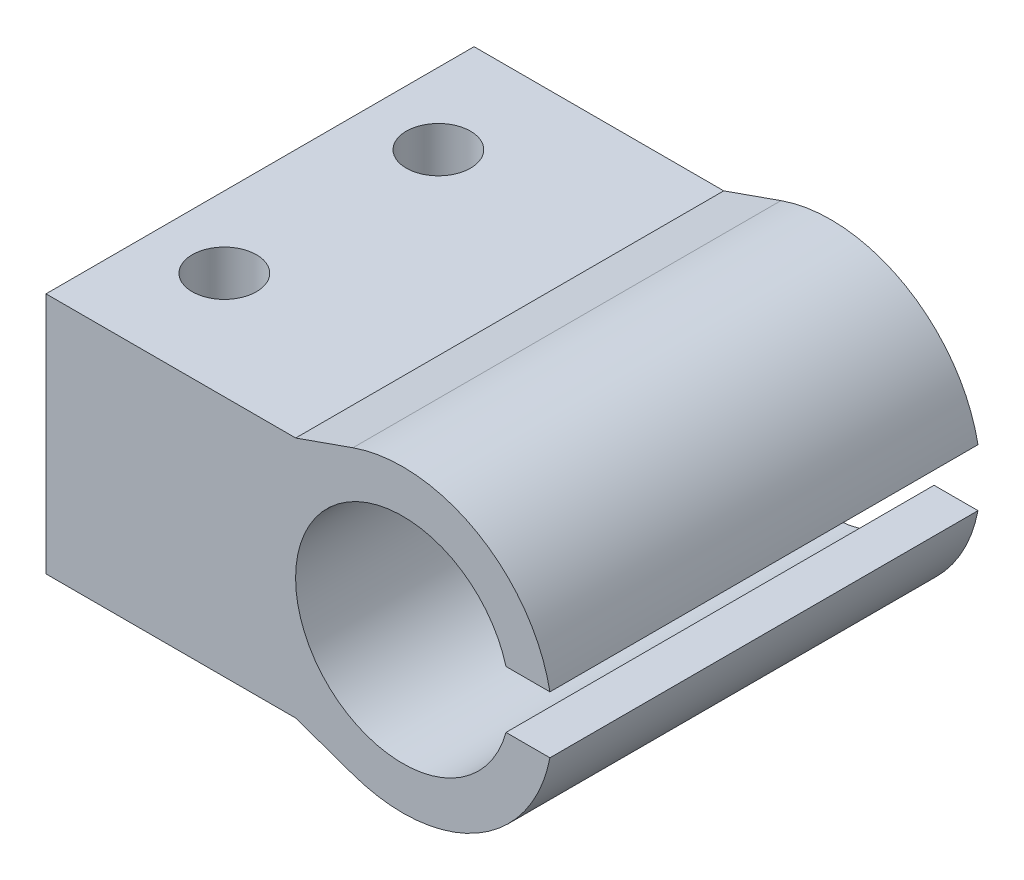
ISO-10303-21;
HEADER;
FILE_DESCRIPTION(('STEP AP214'),'2;1');
FILE_NAME('part.step','',(''),(''),'','','');
FILE_SCHEMA(('AUTOMOTIVE_DESIGN { 1 0 10303 214 1 1 1 1 }'));
ENDSEC;
DATA;
#1=APPLICATION_CONTEXT('core data for automotive mechanical design processes');
#2=APPLICATION_PROTOCOL_DEFINITION('international standard','automotive_design',2000,#1);
#3=PRODUCT_CONTEXT('',#1,'mechanical');
#4=PRODUCT('Part','Part','',(#3));
#5=PRODUCT_RELATED_PRODUCT_CATEGORY('part','',(#4));
#6=PRODUCT_DEFINITION_FORMATION('','',#4);
#7=PRODUCT_DEFINITION_CONTEXT('part definition',#1,'design');
#8=PRODUCT_DEFINITION('design','',#6,#7);
#9=PRODUCT_DEFINITION_SHAPE('','',#8);
#10=(LENGTH_UNIT() NAMED_UNIT(*) SI_UNIT(.MILLI.,.METRE.));
#11=(NAMED_UNIT(*) PLANE_ANGLE_UNIT() SI_UNIT($,.RADIAN.));
#12=(NAMED_UNIT(*) SI_UNIT($,.STERADIAN.) SOLID_ANGLE_UNIT());
#13=UNCERTAINTY_MEASURE_WITH_UNIT(LENGTH_MEASURE(1.E-05),#10,'distance_accuracy_value','');
#14=(GEOMETRIC_REPRESENTATION_CONTEXT(3) GLOBAL_UNCERTAINTY_ASSIGNED_CONTEXT((#13)) GLOBAL_UNIT_ASSIGNED_CONTEXT((#10,
#11,#12)) REPRESENTATION_CONTEXT('',''));
#15=CARTESIAN_POINT('',(0.,0.,0.));
#16=DIRECTION('',(0.,0.,1.));
#17=DIRECTION('',(1.,0.,0.));
#18=AXIS2_PLACEMENT_3D('',#15,#16,#17);
#19=CARTESIAN_POINT('',(-24.9999999999999,8.50000000000017,30.));
#20=DIRECTION('',(1.,0.,0.));
#21=DIRECTION('',(0.,0.,-1.));
#22=AXIS2_PLACEMENT_3D('',#19,#20,#21);
#23=PLANE('',#22);
#24=DIRECTION('',(0.,-1.,0.));
#25=VECTOR('',#24,1.);
#26=CARTESIAN_POINT('',(-24.9999999999999,8.50000000000017,0.));
#27=LINE('',#26,#25);
#28=CARTESIAN_POINT('',(-24.9999999999999,8.50000000000017,0.));
#29=VERTEX_POINT('',#28);
#30=CARTESIAN_POINT('',(-24.9999999999999,-8.49999999999973,0.));
#31=VERTEX_POINT('',#30);
#32=EDGE_CURVE('E144',#29,#31,#27,.T.);
#33=ORIENTED_EDGE('',*,*,#32,.T.);
#34=DIRECTION('',(0.,0.,-1.));
#35=VECTOR('',#34,1.);
#36=CARTESIAN_POINT('',(-24.9999999999999,-8.49999999999973,30.));
#37=LINE('',#36,#35);
#38=CARTESIAN_POINT('',(-24.9999999999999,-8.49999999999973,30.));
#39=VERTEX_POINT('',#38);
#40=EDGE_CURVE('E11',#39,#31,#37,.T.);
#41=ORIENTED_EDGE('',*,*,#40,.F.);
#42=DIRECTION('',(0.,-1.,0.));
#43=VECTOR('',#42,1.);
#44=CARTESIAN_POINT('',(-24.9999999999999,8.50000000000017,30.));
#45=LINE('',#44,#43);
#46=CARTESIAN_POINT('',(-24.9999999999999,8.50000000000017,30.));
#47=VERTEX_POINT('',#46);
#48=EDGE_CURVE('E163',#47,#39,#45,.T.);
#49=ORIENTED_EDGE('',*,*,#48,.F.);
#50=DIRECTION('',(0.,0.,-1.));
#51=VECTOR('',#50,1.);
#52=CARTESIAN_POINT('',(-24.9999999999999,8.50000000000017,30.));
#53=LINE('',#52,#51);
#54=EDGE_CURVE('E140',#47,#29,#53,.T.);
#55=ORIENTED_EDGE('',*,*,#54,.T.);
#56=EDGE_LOOP('',(#33,#41,#49,#55));
#57=FACE_BOUND('',#56,.T.);
#58=ADVANCED_FACE('F34',(#57),#23,.F.);
#59=CARTESIAN_POINT('',(-24.9999999999999,-8.49999999999973,30.));
#60=DIRECTION('',(0.,1.,0.));
#61=DIRECTION('',(0.,0.,1.));
#62=AXIS2_PLACEMENT_3D('',#59,#60,#61);
#63=PLANE('',#62);
#64=CARTESIAN_POINT('',(-19.9999999999999,-8.49999999999973,22.5));
#65=DIRECTION('',(0.,-1.,0.));
#66=DIRECTION('',(0.,0.,-1.));
#67=AXIS2_PLACEMENT_3D('',#64,#65,#66);
#68=CIRCLE('',#67,2.25);
#69=CARTESIAN_POINT('',(-19.9999999999999,-8.49999999999973,20.25));
#70=VERTEX_POINT('',#69);
#71=EDGE_CURVE('E189',#70,#70,#68,.T.);
#72=ORIENTED_EDGE('',*,*,#71,.F.);
#73=EDGE_LOOP('',(#72));
#74=FACE_BOUND('',#73,.T.);
#75=CARTESIAN_POINT('',(-19.9999999999999,-8.49999999999973,7.5));
#76=DIRECTION('',(0.,-1.,0.));
#77=DIRECTION('',(0.,0.,-1.));
#78=AXIS2_PLACEMENT_3D('',#75,#76,#77);
#79=CIRCLE('',#78,2.25);
#80=CARTESIAN_POINT('',(-19.9999999999999,-8.49999999999973,5.25));
#81=VERTEX_POINT('',#80);
#82=EDGE_CURVE('E181',#81,#81,#79,.T.);
#83=ORIENTED_EDGE('',*,*,#82,.F.);
#84=EDGE_LOOP('',(#83));
#85=FACE_BOUND('',#84,.T.);
#86=DIRECTION('',(1.,0.,0.));
#87=VECTOR('',#86,1.);
#88=CARTESIAN_POINT('',(-24.9999999999999,-8.49999999999973,0.));
#89=LINE('',#88,#87);
#90=CARTESIAN_POINT('',(-7.49999999999984,-8.49999999999973,0.));
#91=VERTEX_POINT('',#90);
#92=EDGE_CURVE('E147',#31,#91,#89,.T.);
#93=ORIENTED_EDGE('',*,*,#92,.T.);
#94=DIRECTION('',(0.,0.,-1.));
#95=VECTOR('',#94,1.);
#96=CARTESIAN_POINT('',(-7.49999999999984,-8.49999999999973,30.));
#97=LINE('',#96,#95);
#98=CARTESIAN_POINT('',(-7.49999999999984,-8.49999999999973,30.));
#99=VERTEX_POINT('',#98);
#100=EDGE_CURVE('E43',#99,#91,#97,.T.);
#101=ORIENTED_EDGE('',*,*,#100,.F.);
#102=DIRECTION('',(1.,0.,0.));
#103=VECTOR('',#102,1.);
#104=CARTESIAN_POINT('',(-24.9999999999999,-8.49999999999973,30.));
#105=LINE('',#104,#103);
#106=EDGE_CURVE('E101',#39,#99,#105,.T.);
#107=ORIENTED_EDGE('',*,*,#106,.F.);
#108=ORIENTED_EDGE('',*,*,#40,.T.);
#109=EDGE_LOOP('',(#93,#101,#107,#108));
#110=FACE_BOUND('',#109,.T.);
#111=ADVANCED_FACE('F230',(#74,#85,#110),#63,.F.);
#112=CARTESIAN_POINT('',(-7.49999999999984,-8.49999999999973,30.));
#113=DIRECTION('',(0.332114966471355,0.943238914085785,0.));
#114=DIRECTION('',(-0.943238914085785,0.332114966471355,0.));
#115=AXIS2_PLACEMENT_3D('',#112,#113,#114);
#116=PLANE('',#115);
#117=DIRECTION('',(0.943238914085785,-0.332114966471355,0.));
#118=VECTOR('',#117,1.);
#119=CARTESIAN_POINT('',(-7.49999999999984,-8.49999999999973,0.));
#120=LINE('',#119,#118);
#121=CARTESIAN_POINT('',(-3.48999459492783,-9.91192521933427,0.));
#122=VERTEX_POINT('',#121);
#123=EDGE_CURVE('E150',#91,#122,#120,.T.);
#124=ORIENTED_EDGE('',*,*,#123,.T.);
#125=DIRECTION('',(0.,0.,-1.));
#126=VECTOR('',#125,1.);
#127=CARTESIAN_POINT('',(-3.48999459492783,-9.91192521933427,30.));
#128=LINE('',#127,#126);
#129=CARTESIAN_POINT('',(-3.48999459492783,-9.91192521933427,30.));
#130=VERTEX_POINT('',#129);
#131=EDGE_CURVE('E176',#130,#122,#128,.T.);
#132=ORIENTED_EDGE('',*,*,#131,.F.);
#133=DIRECTION('',(0.943238914085785,-0.332114966471355,0.));
#134=VECTOR('',#133,1.);
#135=CARTESIAN_POINT('',(-7.49999999999984,-8.49999999999973,30.));
#136=LINE('',#135,#134);
#137=EDGE_CURVE('E194',#99,#130,#136,.T.);
#138=ORIENTED_EDGE('',*,*,#137,.F.);
#139=ORIENTED_EDGE('',*,*,#100,.T.);
#140=EDGE_LOOP('',(#124,#132,#138,#139));
#141=FACE_BOUND('',#140,.T.);
#142=ADVANCED_FACE('F234',(#141),#116,.F.);
#143=CARTESIAN_POINT('',(0.,0.,30.));
#144=DIRECTION('',(0.,0.,-1.));
#145=DIRECTION('',(-1.,0.,0.));
#146=AXIS2_PLACEMENT_3D('',#143,#144,#145);
#147=CYLINDRICAL_SURFACE('',#146,10.508393018264);
#148=CARTESIAN_POINT('',(0.,0.,0.));
#149=DIRECTION('',(0.,0.,1.));
#150=DIRECTION('',(1.,0.,0.));
#151=AXIS2_PLACEMENT_3D('',#148,#149,#150);
#152=CIRCLE('',#151,10.508393018264);
#153=CARTESIAN_POINT('',(10.3163134804203,-1.99999999999978,0.));
#154=VERTEX_POINT('',#153);
#155=EDGE_CURVE('E152',#122,#154,#152,.T.);
#156=ORIENTED_EDGE('',*,*,#155,.T.);
#157=DIRECTION('',(0.,0.,-1.));
#158=VECTOR('',#157,1.);
#159=CARTESIAN_POINT('',(10.3163134804203,-1.99999999999978,30.));
#160=LINE('',#159,#158);
#161=CARTESIAN_POINT('',(10.3163134804203,-1.99999999999978,30.));
#162=VERTEX_POINT('',#161);
#163=EDGE_CURVE('E173',#162,#154,#160,.T.);
#164=ORIENTED_EDGE('',*,*,#163,.F.);
#165=CARTESIAN_POINT('',(0.,0.,30.));
#166=DIRECTION('',(0.,0.,1.));
#167=DIRECTION('',(1.,0.,0.));
#168=AXIS2_PLACEMENT_3D('',#165,#166,#167);
#169=CIRCLE('',#168,10.508393018264);
#170=EDGE_CURVE('E196',#130,#162,#169,.T.);
#171=ORIENTED_EDGE('',*,*,#170,.F.);
#172=ORIENTED_EDGE('',*,*,#131,.T.);
#173=EDGE_LOOP('',(#156,#164,#171,#172));
#174=FACE_BOUND('',#173,.T.);
#175=ADVANCED_FACE('F239',(#174),#147,.T.);
#176=CARTESIAN_POINT('',(7.23712413301853,-1.99999999999979,30.));
#177=DIRECTION('',(0.,-1.,0.));
#178=DIRECTION('',(1.,0.,0.));
#179=AXIS2_PLACEMENT_3D('',#176,#177,#178);
#180=PLANE('',#179);
#181=DIRECTION('',(-1.,0.,0.));
#182=VECTOR('',#181,1.);
#183=CARTESIAN_POINT('',(7.23712413301853,-1.99999999999979,0.));
#184=LINE('',#183,#182);
#185=CARTESIAN_POINT('',(7.23712413301853,-1.99999999999979,0.));
#186=VERTEX_POINT('',#185);
#187=EDGE_CURVE('E154',#154,#186,#184,.T.);
#188=ORIENTED_EDGE('',*,*,#187,.T.);
#189=DIRECTION('',(0.,0.,-1.));
#190=VECTOR('',#189,1.);
#191=CARTESIAN_POINT('',(7.23712413301853,-1.99999999999979,30.));
#192=LINE('',#191,#190);
#193=CARTESIAN_POINT('',(7.23712413301853,-1.99999999999979,30.));
#194=VERTEX_POINT('',#193);
#195=EDGE_CURVE('E170',#194,#186,#192,.T.);
#196=ORIENTED_EDGE('',*,*,#195,.F.);
#197=DIRECTION('',(-1.,0.,0.));
#198=VECTOR('',#197,1.);
#199=CARTESIAN_POINT('',(7.23712413301853,-1.99999999999979,30.));
#200=LINE('',#199,#198);
#201=EDGE_CURVE('E198',#162,#194,#200,.T.);
#202=ORIENTED_EDGE('',*,*,#201,.F.);
#203=ORIENTED_EDGE('',*,*,#163,.T.);
#204=EDGE_LOOP('',(#188,#196,#202,#203));
#205=FACE_BOUND('',#204,.T.);
#206=ADVANCED_FACE('F247',(#205),#180,.F.);
#207=CARTESIAN_POINT('',(0.,0.,30.));
#208=DIRECTION('',(0.,0.,-1.));
#209=DIRECTION('',(-1.,0.,0.));
#210=AXIS2_PLACEMENT_3D('',#207,#208,#209);
#211=CYLINDRICAL_SURFACE('',#210,7.50839301826418);
#212=CARTESIAN_POINT('',(0.,0.,0.));
#213=DIRECTION('',(0.,0.,-1.));
#214=DIRECTION('',(1.,0.,0.));
#215=AXIS2_PLACEMENT_3D('',#212,#213,#214);
#216=CIRCLE('',#215,7.50839301826418);
#217=CARTESIAN_POINT('',(7.23712413301841,2.00000000000021,0.));
#218=VERTEX_POINT('',#217);
#219=EDGE_CURVE('E156',#186,#218,#216,.T.);
#220=ORIENTED_EDGE('',*,*,#219,.T.);
#221=DIRECTION('',(0.,0.,-1.));
#222=VECTOR('',#221,1.);
#223=CARTESIAN_POINT('',(7.23712413301841,2.00000000000021,30.));
#224=LINE('',#223,#222);
#225=CARTESIAN_POINT('',(7.23712413301841,2.00000000000021,30.));
#226=VERTEX_POINT('',#225);
#227=EDGE_CURVE('E167',#226,#218,#224,.T.);
#228=ORIENTED_EDGE('',*,*,#227,.F.);
#229=CARTESIAN_POINT('',(0.,0.,30.));
#230=DIRECTION('',(0.,0.,-1.));
#231=DIRECTION('',(1.,0.,0.));
#232=AXIS2_PLACEMENT_3D('',#229,#230,#231);
#233=CIRCLE('',#232,7.50839301826418);
#234=EDGE_CURVE('E200',#194,#226,#233,.T.);
#235=ORIENTED_EDGE('',*,*,#234,.F.);
#236=ORIENTED_EDGE('',*,*,#195,.T.);
#237=EDGE_LOOP('',(#220,#228,#235,#236));
#238=FACE_BOUND('',#237,.T.);
#239=ADVANCED_FACE('F206',(#238),#211,.F.);
#240=CARTESIAN_POINT('',(7.23712413301841,2.00000000000021,30.));
#241=DIRECTION('',(0.,1.,0.));
#242=DIRECTION('',(-1.,0.,0.));
#243=AXIS2_PLACEMENT_3D('',#240,#241,#242);
#244=PLANE('',#243);
#245=DIRECTION('',(1.,0.,0.));
#246=VECTOR('',#245,1.);
#247=CARTESIAN_POINT('',(7.23712413301841,2.00000000000021,0.));
#248=LINE('',#247,#246);
#249=CARTESIAN_POINT('',(10.3163134804204,2.00000000000025,0.));
#250=VERTEX_POINT('',#249);
#251=EDGE_CURVE('E158',#218,#250,#248,.T.);
#252=ORIENTED_EDGE('',*,*,#251,.T.);
#253=DIRECTION('',(0.,0.,-1.));
#254=VECTOR('',#253,1.);
#255=CARTESIAN_POINT('',(10.3163134804204,2.00000000000025,30.));
#256=LINE('',#255,#254);
#257=CARTESIAN_POINT('',(10.3163134804204,2.00000000000025,30.));
#258=VERTEX_POINT('',#257);
#259=EDGE_CURVE('E135',#258,#250,#256,.T.);
#260=ORIENTED_EDGE('',*,*,#259,.F.);
#261=DIRECTION('',(1.,0.,0.));
#262=VECTOR('',#261,1.);
#263=CARTESIAN_POINT('',(7.23712413301841,2.00000000000021,30.));
#264=LINE('',#263,#262);
#265=EDGE_CURVE('E126',#226,#258,#264,.T.);
#266=ORIENTED_EDGE('',*,*,#265,.F.);
#267=ORIENTED_EDGE('',*,*,#227,.T.);
#268=EDGE_LOOP('',(#252,#260,#266,#267));
#269=FACE_BOUND('',#268,.T.);
#270=ADVANCED_FACE('F210',(#269),#244,.F.);
#271=CARTESIAN_POINT('',(0.,0.,30.));
#272=DIRECTION('',(0.,0.,-1.));
#273=DIRECTION('',(-1.,0.,0.));
#274=AXIS2_PLACEMENT_3D('',#271,#272,#273);
#275=CYLINDRICAL_SURFACE('',#274,10.5083930182643);
#276=CARTESIAN_POINT('',(0.,0.,0.));
#277=DIRECTION('',(0.,0.,1.));
#278=DIRECTION('',(1.,0.,0.));
#279=AXIS2_PLACEMENT_3D('',#276,#277,#278);
#280=CIRCLE('',#279,10.5083930182643);
#281=CARTESIAN_POINT('',(-3.48999459492777,9.91192521933456,0.));
#282=VERTEX_POINT('',#281);
#283=EDGE_CURVE('E134',#250,#282,#280,.T.);
#284=ORIENTED_EDGE('',*,*,#283,.T.);
#285=DIRECTION('',(0.,0.,-1.));
#286=VECTOR('',#285,1.);
#287=CARTESIAN_POINT('',(-3.48999459492777,9.91192521933456,30.));
#288=LINE('',#287,#286);
#289=CARTESIAN_POINT('',(-3.48999459492777,9.91192521933456,30.));
#290=VERTEX_POINT('',#289);
#291=EDGE_CURVE('E131',#290,#282,#288,.T.);
#292=ORIENTED_EDGE('',*,*,#291,.F.);
#293=CARTESIAN_POINT('',(0.,0.,30.));
#294=DIRECTION('',(0.,0.,1.));
#295=DIRECTION('',(1.,0.,0.));
#296=AXIS2_PLACEMENT_3D('',#293,#294,#295);
#297=CIRCLE('',#296,10.5083930182643);
#298=EDGE_CURVE('E120',#258,#290,#297,.T.);
#299=ORIENTED_EDGE('',*,*,#298,.F.);
#300=ORIENTED_EDGE('',*,*,#259,.T.);
#301=EDGE_LOOP('',(#284,#292,#299,#300));
#302=FACE_BOUND('',#301,.T.);
#303=ADVANCED_FACE('F132',(#302),#275,.T.);
#304=CARTESIAN_POINT('',(-7.49999999999984,8.50000000000017,30.));
#305=DIRECTION('',(0.332114966471318,-0.943238914085798,0.));
#306=DIRECTION('',(0.943238914085798,0.332114966471318,0.));
#307=AXIS2_PLACEMENT_3D('',#304,#305,#306);
#308=PLANE('',#307);
#309=DIRECTION('',(-0.943238914085798,-0.332114966471318,0.));
#310=VECTOR('',#309,1.);
#311=CARTESIAN_POINT('',(-7.49999999999984,8.50000000000017,0.));
#312=LINE('',#311,#310);
#313=CARTESIAN_POINT('',(-7.49999999999984,8.50000000000017,0.));
#314=VERTEX_POINT('',#313);
#315=EDGE_CURVE('E87',#282,#314,#312,.T.);
#316=ORIENTED_EDGE('',*,*,#315,.T.);
#317=DIRECTION('',(0.,0.,-1.));
#318=VECTOR('',#317,1.);
#319=CARTESIAN_POINT('',(-7.49999999999984,8.50000000000017,30.));
#320=LINE('',#319,#318);
#321=CARTESIAN_POINT('',(-7.49999999999984,8.50000000000017,30.));
#322=VERTEX_POINT('',#321);
#323=EDGE_CURVE('E136',#322,#314,#320,.T.);
#324=ORIENTED_EDGE('',*,*,#323,.F.);
#325=DIRECTION('',(-0.943238914085798,-0.332114966471318,0.));
#326=VECTOR('',#325,1.);
#327=CARTESIAN_POINT('',(-7.49999999999984,8.50000000000017,30.));
#328=LINE('',#327,#326);
#329=EDGE_CURVE('E124',#290,#322,#328,.T.);
#330=ORIENTED_EDGE('',*,*,#329,.F.);
#331=ORIENTED_EDGE('',*,*,#291,.T.);
#332=EDGE_LOOP('',(#316,#324,#330,#331));
#333=FACE_BOUND('',#332,.T.);
#334=ADVANCED_FACE('F138',(#333),#308,.F.);
#335=CARTESIAN_POINT('',(-24.9999999999999,8.50000000000017,30.));
#336=DIRECTION('',(0.,-1.,0.));
#337=DIRECTION('',(0.,0.,-1.));
#338=AXIS2_PLACEMENT_3D('',#335,#336,#337);
#339=PLANE('',#338);
#340=CARTESIAN_POINT('',(-19.9999999999999,8.50000000000017,22.5));
#341=DIRECTION('',(0.,-1.,0.));
#342=DIRECTION('',(0.,0.,-1.));
#343=AXIS2_PLACEMENT_3D('',#340,#341,#342);
#344=CIRCLE('',#343,2.25);
#345=CARTESIAN_POINT('',(-19.9999999999999,8.50000000000017,20.25));
#346=VERTEX_POINT('',#345);
#347=EDGE_CURVE('E37',#346,#346,#344,.T.);
#348=ORIENTED_EDGE('',*,*,#347,.T.);
#349=EDGE_LOOP('',(#348));
#350=FACE_BOUND('',#349,.T.);
#351=CARTESIAN_POINT('',(-19.9999999999999,8.50000000000017,7.5));
#352=DIRECTION('',(0.,-1.,0.));
#353=DIRECTION('',(0.,0.,-1.));
#354=AXIS2_PLACEMENT_3D('',#351,#352,#353);
#355=CIRCLE('',#354,2.25);
#356=CARTESIAN_POINT('',(-19.9999999999999,8.50000000000017,5.25));
#357=VERTEX_POINT('',#356);
#358=EDGE_CURVE('E148',#357,#357,#355,.T.);
#359=ORIENTED_EDGE('',*,*,#358,.T.);
#360=EDGE_LOOP('',(#359));
#361=FACE_BOUND('',#360,.T.);
#362=DIRECTION('',(-1.,0.,0.));
#363=VECTOR('',#362,1.);
#364=CARTESIAN_POINT('',(-24.9999999999999,8.50000000000017,0.));
#365=LINE('',#364,#363);
#366=EDGE_CURVE('E93',#314,#29,#365,.T.);
#367=ORIENTED_EDGE('',*,*,#366,.T.);
#368=ORIENTED_EDGE('',*,*,#54,.F.);
#369=DIRECTION('',(-1.,0.,0.));
#370=VECTOR('',#369,1.);
#371=CARTESIAN_POINT('',(-24.9999999999999,8.50000000000017,30.));
#372=LINE('',#371,#370);
#373=EDGE_CURVE('E52',#322,#47,#372,.T.);
#374=ORIENTED_EDGE('',*,*,#373,.F.);
#375=ORIENTED_EDGE('',*,*,#323,.T.);
#376=EDGE_LOOP('',(#367,#368,#374,#375));
#377=FACE_BOUND('',#376,.T.);
#378=ADVANCED_FACE('F218',(#350,#361,#377),#339,.F.);
#379=CARTESIAN_POINT('',(0.,0.,30.));
#380=DIRECTION('',(0.,0.,1.));
#381=DIRECTION('',(1.,0.,0.));
#382=AXIS2_PLACEMENT_3D('',#379,#380,#381);
#383=PLANE('',#382);
#384=ORIENTED_EDGE('',*,*,#48,.T.);
#385=ORIENTED_EDGE('',*,*,#106,.T.);
#386=ORIENTED_EDGE('',*,*,#137,.T.);
#387=ORIENTED_EDGE('',*,*,#170,.T.);
#388=ORIENTED_EDGE('',*,*,#201,.T.);
#389=ORIENTED_EDGE('',*,*,#234,.T.);
#390=ORIENTED_EDGE('',*,*,#265,.T.);
#391=ORIENTED_EDGE('',*,*,#298,.T.);
#392=ORIENTED_EDGE('',*,*,#329,.T.);
#393=ORIENTED_EDGE('',*,*,#373,.T.);
#394=EDGE_LOOP('',(#384,#385,#386,#387,#388,#389,#390,#391,#392,#393));
#395=FACE_BOUND('',#394,.T.);
#396=ADVANCED_FACE('F122',(#395),#383,.T.);
#397=CARTESIAN_POINT('',(0.,0.,0.));
#398=DIRECTION('',(0.,0.,1.));
#399=DIRECTION('',(1.,0.,0.));
#400=AXIS2_PLACEMENT_3D('',#397,#398,#399);
#401=PLANE('',#400);
#402=ORIENTED_EDGE('',*,*,#32,.F.);
#403=ORIENTED_EDGE('',*,*,#366,.F.);
#404=ORIENTED_EDGE('',*,*,#315,.F.);
#405=ORIENTED_EDGE('',*,*,#283,.F.);
#406=ORIENTED_EDGE('',*,*,#251,.F.);
#407=ORIENTED_EDGE('',*,*,#219,.F.);
#408=ORIENTED_EDGE('',*,*,#187,.F.);
#409=ORIENTED_EDGE('',*,*,#155,.F.);
#410=ORIENTED_EDGE('',*,*,#123,.F.);
#411=ORIENTED_EDGE('',*,*,#92,.F.);
#412=EDGE_LOOP('',(#402,#403,#404,#405,#406,#407,#408,#409,#410,#411));
#413=FACE_BOUND('',#412,.T.);
#414=ADVANCED_FACE('F213',(#413),#401,.F.);
#415=CARTESIAN_POINT('',(-19.9999999999999,10.5083930182643,7.5));
#416=DIRECTION('',(0.,-1.,0.));
#417=DIRECTION('',(0.,0.,-1.));
#418=AXIS2_PLACEMENT_3D('',#415,#416,#417);
#419=CYLINDRICAL_SURFACE('',#418,2.25);
#420=ORIENTED_EDGE('',*,*,#82,.T.);
#421=EDGE_LOOP('',(#420));
#422=FACE_BOUND('',#421,.T.);
#423=ORIENTED_EDGE('',*,*,#358,.F.);
#424=EDGE_LOOP('',(#423));
#425=FACE_BOUND('',#424,.T.);
#426=ADVANCED_FACE('F280',(#422,#425),#419,.F.);
#427=CARTESIAN_POINT('',(-19.9999999999999,10.5083930182643,22.5));
#428=DIRECTION('',(0.,-1.,0.));
#429=DIRECTION('',(0.,0.,-1.));
#430=AXIS2_PLACEMENT_3D('',#427,#428,#429);
#431=CYLINDRICAL_SURFACE('',#430,2.25);
#432=ORIENTED_EDGE('',*,*,#71,.T.);
#433=EDGE_LOOP('',(#432));
#434=FACE_BOUND('',#433,.T.);
#435=ORIENTED_EDGE('',*,*,#347,.F.);
#436=EDGE_LOOP('',(#435));
#437=FACE_BOUND('',#436,.T.);
#438=ADVANCED_FACE('F298',(#434,#437),#431,.F.);
#439=CLOSED_SHELL('',(#58,#111,#142,#175,#206,#239,#270,#303,#334,#378,#396,#414,#426,#438));
#440=MANIFOLD_SOLID_BREP('B2',#439);
#441=ADVANCED_BREP_SHAPE_REPRESENTATION('',(#18,#440),#14);
#442=SHAPE_DEFINITION_REPRESENTATION(#9,#441);
ENDSEC;
END-ISO-10303-21;
